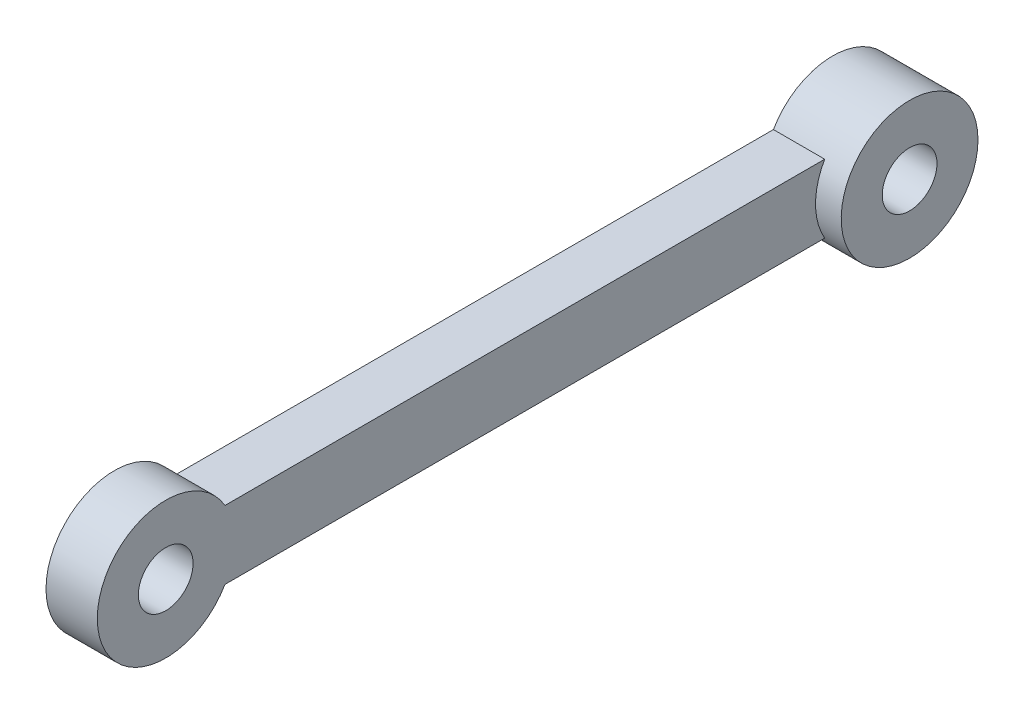
ISO-10303-21;
HEADER;
FILE_DESCRIPTION(('STEP AP214'),'2;1');
FILE_NAME('part.step','',(''),(''),'','','');
FILE_SCHEMA(('AUTOMOTIVE_DESIGN { 1 0 10303 214 1 1 1 1 }'));
ENDSEC;
DATA;
#1=APPLICATION_CONTEXT('core data for automotive mechanical design processes');
#2=APPLICATION_PROTOCOL_DEFINITION('international standard','automotive_design',2000,#1);
#3=PRODUCT_CONTEXT('',#1,'mechanical');
#4=PRODUCT('Part','Part','',(#3));
#5=PRODUCT_RELATED_PRODUCT_CATEGORY('part','',(#4));
#6=PRODUCT_DEFINITION_FORMATION('','',#4);
#7=PRODUCT_DEFINITION_CONTEXT('part definition',#1,'design');
#8=PRODUCT_DEFINITION('design','',#6,#7);
#9=PRODUCT_DEFINITION_SHAPE('','',#8);
#10=(LENGTH_UNIT() NAMED_UNIT(*) SI_UNIT(.MILLI.,.METRE.));
#11=(NAMED_UNIT(*) PLANE_ANGLE_UNIT() SI_UNIT($,.RADIAN.));
#12=(NAMED_UNIT(*) SI_UNIT($,.STERADIAN.) SOLID_ANGLE_UNIT());
#13=UNCERTAINTY_MEASURE_WITH_UNIT(LENGTH_MEASURE(1.E-05),#10,'distance_accuracy_value','');
#14=(GEOMETRIC_REPRESENTATION_CONTEXT(3) GLOBAL_UNCERTAINTY_ASSIGNED_CONTEXT((#13)) GLOBAL_UNIT_ASSIGNED_CONTEXT((#10,
#11,#12)) REPRESENTATION_CONTEXT('',''));
#15=CARTESIAN_POINT('',(0.,0.,0.));
#16=DIRECTION('',(0.,0.,1.));
#17=DIRECTION('',(1.,0.,0.));
#18=AXIS2_PLACEMENT_3D('',#15,#16,#17);
#19=CARTESIAN_POINT('',(3.,0.,0.));
#20=DIRECTION('',(1.,0.,0.));
#21=DIRECTION('',(0.,0.,-1.));
#22=AXIS2_PLACEMENT_3D('',#19,#20,#21);
#23=PLANE('',#22);
#24=CARTESIAN_POINT('',(3.,0.,-42.));
#25=DIRECTION('',(1.,0.,0.));
#26=DIRECTION('',(0.,0.,-1.));
#27=AXIS2_PLACEMENT_3D('',#24,#25,#26);
#28=CIRCLE('',#27,4.);
#29=CARTESIAN_POINT('',(3.,2.,-38.5358983848623));
#30=VERTEX_POINT('',#29);
#31=CARTESIAN_POINT('',(3.,-2.,-38.5358983848623));
#32=VERTEX_POINT('',#31);
#33=EDGE_CURVE('E85',#30,#32,#28,.T.);
#34=ORIENTED_EDGE('',*,*,#33,.F.);
#35=DIRECTION('',(0.,0.,1.));
#36=VECTOR('',#35,1.);
#37=CARTESIAN_POINT('',(3.,2.,-21.));
#38=LINE('',#37,#36);
#39=CARTESIAN_POINT('',(3.,2.,-3.46410161513775));
#40=VERTEX_POINT('',#39);
#41=EDGE_CURVE('E91',#30,#40,#38,.T.);
#42=ORIENTED_EDGE('',*,*,#41,.T.);
#43=CARTESIAN_POINT('',(3.,0.,0.));
#44=DIRECTION('',(1.,0.,0.));
#45=DIRECTION('',(0.,0.,-1.));
#46=AXIS2_PLACEMENT_3D('',#43,#44,#45);
#47=CIRCLE('',#46,4.);
#48=CARTESIAN_POINT('',(3.,-2.,-3.46410161513775));
#49=VERTEX_POINT('',#48);
#50=EDGE_CURVE('E77',#40,#49,#47,.T.);
#51=ORIENTED_EDGE('',*,*,#50,.T.);
#52=DIRECTION('',(0.,0.,-1.));
#53=VECTOR('',#52,1.);
#54=CARTESIAN_POINT('',(3.,-2.,-21.));
#55=LINE('',#54,#53);
#56=EDGE_CURVE('E50',#49,#32,#55,.T.);
#57=ORIENTED_EDGE('',*,*,#56,.T.);
#58=EDGE_LOOP('',(#34,#42,#51,#57));
#59=FACE_BOUND('',#58,.T.);
#60=CARTESIAN_POINT('',(3.,0.,0.));
#61=DIRECTION('',(1.,0.,0.));
#62=DIRECTION('',(0.,0.,-1.));
#63=AXIS2_PLACEMENT_3D('',#60,#61,#62);
#64=CIRCLE('',#63,1.6);
#65=CARTESIAN_POINT('',(3.,0.,-1.6));
#66=VERTEX_POINT('',#65);
#67=EDGE_CURVE('E108',#66,#66,#64,.T.);
#68=ORIENTED_EDGE('',*,*,#67,.F.);
#69=EDGE_LOOP('',(#68));
#70=FACE_BOUND('',#69,.T.);
#71=ADVANCED_FACE('F33',(#59,#70),#23,.T.);
#72=CARTESIAN_POINT('',(0.,0.,0.));
#73=DIRECTION('',(1.,0.,0.));
#74=DIRECTION('',(0.,0.,-1.));
#75=AXIS2_PLACEMENT_3D('',#72,#73,#74);
#76=PLANE('',#75);
#77=CARTESIAN_POINT('',(0.,0.,0.));
#78=DIRECTION('',(1.,0.,0.));
#79=DIRECTION('',(0.,0.,-1.));
#80=AXIS2_PLACEMENT_3D('',#77,#78,#79);
#81=CIRCLE('',#80,4.);
#82=CARTESIAN_POINT('',(0.,2.,-3.46410161513775));
#83=VERTEX_POINT('',#82);
#84=CARTESIAN_POINT('',(0.,-2.,-3.46410161513775));
#85=VERTEX_POINT('',#84);
#86=EDGE_CURVE('E111',#83,#85,#81,.T.);
#87=ORIENTED_EDGE('',*,*,#86,.F.);
#88=DIRECTION('',(0.,0.,1.));
#89=VECTOR('',#88,1.);
#90=CARTESIAN_POINT('',(0.,2.,-21.));
#91=LINE('',#90,#89);
#92=CARTESIAN_POINT('',(0.,2.,-38.5358983848623));
#93=VERTEX_POINT('',#92);
#94=EDGE_CURVE('E93',#93,#83,#91,.T.);
#95=ORIENTED_EDGE('',*,*,#94,.F.);
#96=CARTESIAN_POINT('',(0.,0.,-42.));
#97=DIRECTION('',(1.,0.,0.));
#98=DIRECTION('',(0.,0.,-1.));
#99=AXIS2_PLACEMENT_3D('',#96,#97,#98);
#100=CIRCLE('',#99,4.);
#101=CARTESIAN_POINT('',(0.,-2.,-38.5358983848623));
#102=VERTEX_POINT('',#101);
#103=EDGE_CURVE('E72',#102,#93,#100,.T.);
#104=ORIENTED_EDGE('',*,*,#103,.F.);
#105=DIRECTION('',(0.,0.,-1.));
#106=VECTOR('',#105,1.);
#107=CARTESIAN_POINT('',(0.,-2.,-21.));
#108=LINE('',#107,#106);
#109=EDGE_CURVE('E66',#85,#102,#108,.T.);
#110=ORIENTED_EDGE('',*,*,#109,.F.);
#111=EDGE_LOOP('',(#87,#95,#104,#110));
#112=FACE_BOUND('',#111,.T.);
#113=CARTESIAN_POINT('',(0.,0.,0.));
#114=DIRECTION('',(1.,0.,0.));
#115=DIRECTION('',(0.,0.,-1.));
#116=AXIS2_PLACEMENT_3D('',#113,#114,#115);
#117=CIRCLE('',#116,1.6);
#118=CARTESIAN_POINT('',(0.,0.,-1.6));
#119=VERTEX_POINT('',#118);
#120=EDGE_CURVE('E107',#119,#119,#117,.T.);
#121=ORIENTED_EDGE('',*,*,#120,.T.);
#122=EDGE_LOOP('',(#121));
#123=FACE_BOUND('',#122,.T.);
#124=CARTESIAN_POINT('',(0.,0.,-42.));
#125=DIRECTION('',(1.,0.,0.));
#126=DIRECTION('',(0.,0.,-1.));
#127=AXIS2_PLACEMENT_3D('',#124,#125,#126);
#128=CIRCLE('',#127,1.6);
#129=CARTESIAN_POINT('',(0.,0.,-43.6));
#130=VERTEX_POINT('',#129);
#131=EDGE_CURVE('E100',#130,#130,#128,.T.);
#132=ORIENTED_EDGE('',*,*,#131,.T.);
#133=EDGE_LOOP('',(#132));
#134=FACE_BOUND('',#133,.T.);
#135=ADVANCED_FACE('F124',(#112,#123,#134),#76,.F.);
#136=CARTESIAN_POINT('',(3.,0.,0.));
#137=DIRECTION('',(-1.,0.,0.));
#138=DIRECTION('',(0.,0.,1.));
#139=AXIS2_PLACEMENT_3D('',#136,#137,#138);
#140=CYLINDRICAL_SURFACE('',#139,4.);
#141=ORIENTED_EDGE('',*,*,#86,.T.);
#142=DIRECTION('',(-1.,0.,0.));
#143=VECTOR('',#142,1.);
#144=CARTESIAN_POINT('',(3.,-2.,-3.46410161513775));
#145=LINE('',#144,#143);
#146=EDGE_CURVE('E42',#49,#85,#145,.T.);
#147=ORIENTED_EDGE('',*,*,#146,.F.);
#148=ORIENTED_EDGE('',*,*,#50,.F.);
#149=DIRECTION('',(-1.,0.,0.));
#150=VECTOR('',#149,1.);
#151=CARTESIAN_POINT('',(3.,2.,-3.46410161513775));
#152=LINE('',#151,#150);
#153=EDGE_CURVE('E11',#40,#83,#152,.T.);
#154=ORIENTED_EDGE('',*,*,#153,.T.);
#155=EDGE_LOOP('',(#141,#147,#148,#154));
#156=FACE_BOUND('',#155,.T.);
#157=ADVANCED_FACE('F35',(#156),#140,.T.);
#158=CARTESIAN_POINT('',(3.,-2.,-21.));
#159=DIRECTION('',(0.,1.,0.));
#160=DIRECTION('',(0.,0.,1.));
#161=AXIS2_PLACEMENT_3D('',#158,#159,#160);
#162=PLANE('',#161);
#163=ORIENTED_EDGE('',*,*,#109,.T.);
#164=DIRECTION('',(-1.,0.,0.));
#165=VECTOR('',#164,1.);
#166=CARTESIAN_POINT('',(3.,-2.,-38.5358983848623));
#167=LINE('',#166,#165);
#168=EDGE_CURVE('E88',#32,#102,#167,.T.);
#169=ORIENTED_EDGE('',*,*,#168,.F.);
#170=ORIENTED_EDGE('',*,*,#56,.F.);
#171=ORIENTED_EDGE('',*,*,#146,.T.);
#172=EDGE_LOOP('',(#163,#169,#170,#171));
#173=FACE_BOUND('',#172,.T.);
#174=ADVANCED_FACE('F121',(#173),#162,.F.);
#175=CARTESIAN_POINT('',(3.,0.,-42.));
#176=DIRECTION('',(-1.,0.,0.));
#177=DIRECTION('',(0.,0.,1.));
#178=AXIS2_PLACEMENT_3D('',#175,#176,#177);
#179=CYLINDRICAL_SURFACE('',#178,4.);
#180=ORIENTED_EDGE('',*,*,#103,.T.);
#181=DIRECTION('',(-1.,0.,0.));
#182=VECTOR('',#181,1.);
#183=CARTESIAN_POINT('',(3.,2.,-38.5358983848623));
#184=LINE('',#183,#182);
#185=EDGE_CURVE('E81',#30,#93,#184,.T.);
#186=ORIENTED_EDGE('',*,*,#185,.F.);
#187=ORIENTED_EDGE('',*,*,#33,.T.);
#188=ORIENTED_EDGE('',*,*,#168,.T.);
#189=EDGE_LOOP('',(#180,#186,#187,#188));
#190=FACE_BOUND('',#189,.T.);
#191=CARTESIAN_POINT('',(4.5,0.,-42.));
#192=DIRECTION('',(1.,0.,0.));
#193=DIRECTION('',(0.,0.,-1.));
#194=AXIS2_PLACEMENT_3D('',#191,#192,#193);
#195=CIRCLE('',#194,4.);
#196=CARTESIAN_POINT('',(4.5,0.,-46.));
#197=VERTEX_POINT('',#196);
#198=EDGE_CURVE('E96',#197,#197,#195,.T.);
#199=ORIENTED_EDGE('',*,*,#198,.F.);
#200=EDGE_LOOP('',(#199));
#201=FACE_BOUND('',#200,.T.);
#202=ADVANCED_FACE('F83',(#190,#201),#179,.T.);
#203=CARTESIAN_POINT('',(3.,2.,-21.));
#204=DIRECTION('',(0.,-1.,0.));
#205=DIRECTION('',(0.,0.,-1.));
#206=AXIS2_PLACEMENT_3D('',#203,#204,#205);
#207=PLANE('',#206);
#208=ORIENTED_EDGE('',*,*,#94,.T.);
#209=ORIENTED_EDGE('',*,*,#153,.F.);
#210=ORIENTED_EDGE('',*,*,#41,.F.);
#211=ORIENTED_EDGE('',*,*,#185,.T.);
#212=EDGE_LOOP('',(#208,#209,#210,#211));
#213=FACE_BOUND('',#212,.T.);
#214=ADVANCED_FACE('F92',(#213),#207,.F.);
#215=CARTESIAN_POINT('',(3.,0.,0.));
#216=DIRECTION('',(-1.,0.,0.));
#217=DIRECTION('',(0.,0.,1.));
#218=AXIS2_PLACEMENT_3D('',#215,#216,#217);
#219=CYLINDRICAL_SURFACE('',#218,1.6);
#220=ORIENTED_EDGE('',*,*,#67,.T.);
#221=EDGE_LOOP('',(#220));
#222=FACE_BOUND('',#221,.T.);
#223=ORIENTED_EDGE('',*,*,#120,.F.);
#224=EDGE_LOOP('',(#223));
#225=FACE_BOUND('',#224,.T.);
#226=ADVANCED_FACE('F136',(#222,#225),#219,.F.);
#227=CARTESIAN_POINT('',(3.,0.,-42.));
#228=DIRECTION('',(-1.,0.,0.));
#229=DIRECTION('',(0.,0.,1.));
#230=AXIS2_PLACEMENT_3D('',#227,#228,#229);
#231=CYLINDRICAL_SURFACE('',#230,1.6);
#232=ORIENTED_EDGE('',*,*,#131,.F.);
#233=EDGE_LOOP('',(#232));
#234=FACE_BOUND('',#233,.T.);
#235=CARTESIAN_POINT('',(4.5,0.,-42.));
#236=DIRECTION('',(1.,0.,0.));
#237=DIRECTION('',(0.,0.,-1.));
#238=AXIS2_PLACEMENT_3D('',#235,#236,#237);
#239=CIRCLE('',#238,1.6);
#240=CARTESIAN_POINT('',(4.5,0.,-43.6));
#241=VERTEX_POINT('',#240);
#242=EDGE_CURVE('E97',#241,#241,#239,.T.);
#243=ORIENTED_EDGE('',*,*,#242,.T.);
#244=EDGE_LOOP('',(#243));
#245=FACE_BOUND('',#244,.T.);
#246=ADVANCED_FACE('F132',(#234,#245),#231,.F.);
#247=CARTESIAN_POINT('',(4.5,0.,-42.));
#248=DIRECTION('',(1.,0.,0.));
#249=DIRECTION('',(0.,0.,-1.));
#250=AXIS2_PLACEMENT_3D('',#247,#248,#249);
#251=PLANE('',#250);
#252=ORIENTED_EDGE('',*,*,#198,.T.);
#253=EDGE_LOOP('',(#252));
#254=FACE_BOUND('',#253,.T.);
#255=ORIENTED_EDGE('',*,*,#242,.F.);
#256=EDGE_LOOP('',(#255));
#257=FACE_BOUND('',#256,.T.);
#258=ADVANCED_FACE('F135',(#254,#257),#251,.T.);
#259=CLOSED_SHELL('',(#71,#135,#157,#174,#202,#214,#226,#246,#258));
#260=MANIFOLD_SOLID_BREP('B2',#259);
#261=ADVANCED_BREP_SHAPE_REPRESENTATION('',(#18,#260),#14);
#262=SHAPE_DEFINITION_REPRESENTATION(#9,#261);
ENDSEC;
END-ISO-10303-21;
